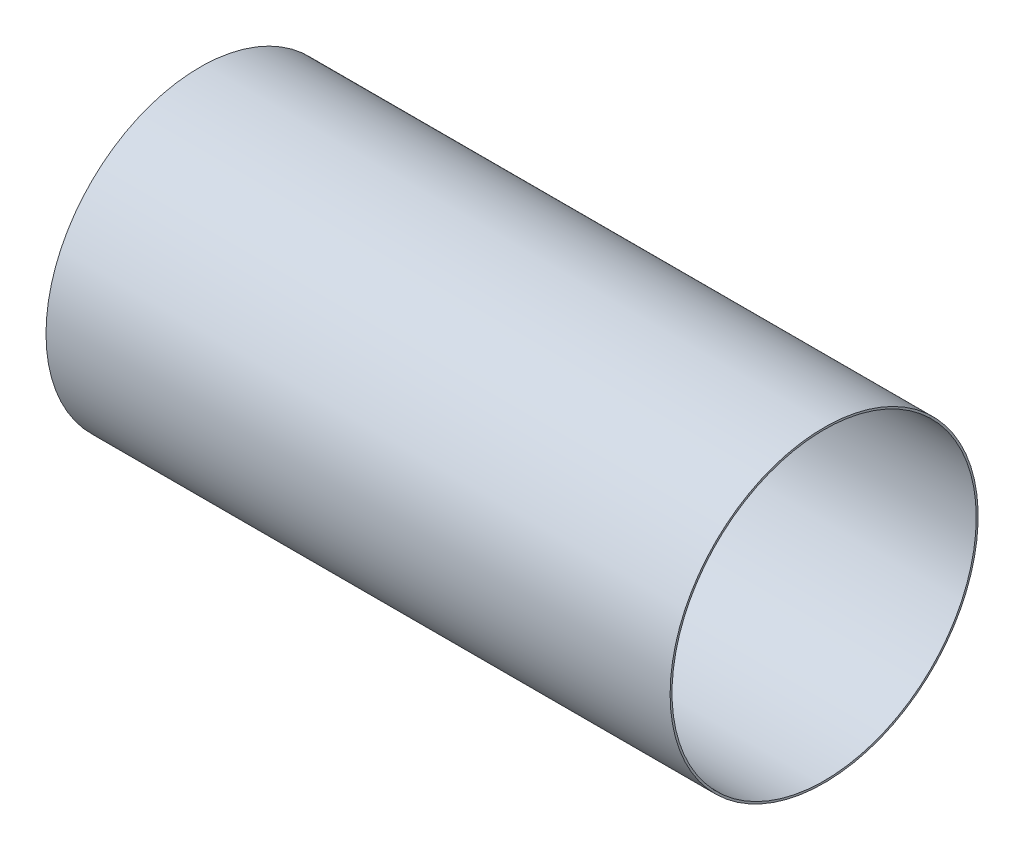
ISO-10303-21;
HEADER;
FILE_DESCRIPTION(('STEP AP214'),'2;1');
FILE_NAME('part.step','',(''),(''),'','','');
FILE_SCHEMA(('AUTOMOTIVE_DESIGN { 1 0 10303 214 1 1 1 1 }'));
ENDSEC;
DATA;
#1=APPLICATION_CONTEXT('core data for automotive mechanical design processes');
#2=APPLICATION_PROTOCOL_DEFINITION('international standard','automotive_design',2000,#1);
#3=PRODUCT_CONTEXT('',#1,'mechanical');
#4=PRODUCT('Part','Part','',(#3));
#5=PRODUCT_RELATED_PRODUCT_CATEGORY('part','',(#4));
#6=PRODUCT_DEFINITION_FORMATION('','',#4);
#7=PRODUCT_DEFINITION_CONTEXT('part definition',#1,'design');
#8=PRODUCT_DEFINITION('design','',#6,#7);
#9=PRODUCT_DEFINITION_SHAPE('','',#8);
#10=(LENGTH_UNIT() NAMED_UNIT(*) SI_UNIT(.MILLI.,.METRE.));
#11=(NAMED_UNIT(*) PLANE_ANGLE_UNIT() SI_UNIT($,.RADIAN.));
#12=(NAMED_UNIT(*) SI_UNIT($,.STERADIAN.) SOLID_ANGLE_UNIT());
#13=UNCERTAINTY_MEASURE_WITH_UNIT(LENGTH_MEASURE(1.E-05),#10,'distance_accuracy_value','');
#14=(GEOMETRIC_REPRESENTATION_CONTEXT(3) GLOBAL_UNCERTAINTY_ASSIGNED_CONTEXT((#13)) GLOBAL_UNIT_ASSIGNED_CONTEXT((#10,
#11,#12)) REPRESENTATION_CONTEXT('',''));
#15=CARTESIAN_POINT('',(0.,0.,0.));
#16=DIRECTION('',(0.,0.,1.));
#17=DIRECTION('',(1.,0.,0.));
#18=AXIS2_PLACEMENT_3D('',#15,#16,#17);
#19=CARTESIAN_POINT('',(304.8,0.,0.));
#20=DIRECTION('',(-1.,0.,0.));
#21=DIRECTION('',(0.,0.,1.));
#22=AXIS2_PLACEMENT_3D('',#19,#20,#21);
#23=CYLINDRICAL_SURFACE('',#22,75.2221);
#24=CARTESIAN_POINT('',(304.8,0.,0.));
#25=DIRECTION('',(1.,0.,0.));
#26=DIRECTION('',(0.,0.,-1.));
#27=AXIS2_PLACEMENT_3D('',#24,#25,#26);
#28=CIRCLE('',#27,75.2221);
#29=CARTESIAN_POINT('',(304.8,0.,75.2221));
#30=VERTEX_POINT('',#29);
#31=EDGE_CURVE('E10',#30,#30,#28,.T.);
#32=CARTESIAN_POINT('',(0.,0.,0.));
#33=DIRECTION('',(1.,0.,0.));
#34=DIRECTION('',(0.,0.,-1.));
#35=AXIS2_PLACEMENT_3D('',#32,#33,#34);
#36=CIRCLE('',#35,75.2221);
#37=CARTESIAN_POINT('',(0.,0.,75.2221));
#38=VERTEX_POINT('',#37);
#39=EDGE_CURVE('E46',#38,#38,#36,.T.);
#40=CARTESIAN_POINT('',(304.8,0.,75.2221));
#41=CARTESIAN_POINT('',(301.625,0.,75.2221));
#42=CARTESIAN_POINT('',(298.45,0.,75.2221));
#43=CARTESIAN_POINT('',(292.1,0.,75.2221));
#44=CARTESIAN_POINT('',(288.925,0.,75.2221));
#45=CARTESIAN_POINT('',(282.575,0.,75.2221));
#46=CARTESIAN_POINT('',(279.4,0.,75.2221));
#47=CARTESIAN_POINT('',(273.05,0.,75.2221));
#48=CARTESIAN_POINT('',(269.875,0.,75.2221));
#49=CARTESIAN_POINT('',(263.525,0.,75.2221));
#50=CARTESIAN_POINT('',(260.35,0.,75.2221));
#51=CARTESIAN_POINT('',(254.,0.,75.2221));
#52=CARTESIAN_POINT('',(250.825,0.,75.2221));
#53=CARTESIAN_POINT('',(244.475,0.,75.2221));
#54=CARTESIAN_POINT('',(241.3,0.,75.2221));
#55=CARTESIAN_POINT('',(234.95,0.,75.2221));
#56=CARTESIAN_POINT('',(231.775,0.,75.2221));
#57=CARTESIAN_POINT('',(225.425,0.,75.2221));
#58=CARTESIAN_POINT('',(222.25,0.,75.2221));
#59=CARTESIAN_POINT('',(215.9,0.,75.2221));
#60=CARTESIAN_POINT('',(212.725,0.,75.2221));
#61=CARTESIAN_POINT('',(206.375,0.,75.2221));
#62=CARTESIAN_POINT('',(203.2,0.,75.2221));
#63=CARTESIAN_POINT('',(196.85,0.,75.2221));
#64=CARTESIAN_POINT('',(193.675,0.,75.2221));
#65=CARTESIAN_POINT('',(187.325,0.,75.2221));
#66=CARTESIAN_POINT('',(184.15,0.,75.2221));
#67=CARTESIAN_POINT('',(177.8,0.,75.2221));
#68=CARTESIAN_POINT('',(174.625,0.,75.2221));
#69=CARTESIAN_POINT('',(168.275,0.,75.2221));
#70=CARTESIAN_POINT('',(165.1,0.,75.2221));
#71=CARTESIAN_POINT('',(158.75,0.,75.2221));
#72=CARTESIAN_POINT('',(155.575,0.,75.2221));
#73=CARTESIAN_POINT('',(149.225,0.,75.2221));
#74=CARTESIAN_POINT('',(146.05,0.,75.2221));
#75=CARTESIAN_POINT('',(139.7,0.,75.2221));
#76=CARTESIAN_POINT('',(136.525,0.,75.2221));
#77=CARTESIAN_POINT('',(130.175,0.,75.2221));
#78=CARTESIAN_POINT('',(127.,0.,75.2221));
#79=CARTESIAN_POINT('',(120.65,0.,75.2221));
#80=CARTESIAN_POINT('',(117.475,0.,75.2221));
#81=CARTESIAN_POINT('',(111.125,0.,75.2221));
#82=CARTESIAN_POINT('',(107.95,0.,75.2221));
#83=CARTESIAN_POINT('',(101.6,0.,75.2221));
#84=CARTESIAN_POINT('',(98.425,0.,75.2221));
#85=CARTESIAN_POINT('',(92.075,0.,75.2221));
#86=CARTESIAN_POINT('',(88.9,0.,75.2221));
#87=CARTESIAN_POINT('',(82.55,0.,75.2221));
#88=CARTESIAN_POINT('',(79.375,0.,75.2221));
#89=CARTESIAN_POINT('',(73.025,0.,75.2221));
#90=CARTESIAN_POINT('',(69.85,0.,75.2221));
#91=CARTESIAN_POINT('',(63.5,0.,75.2221));
#92=CARTESIAN_POINT('',(60.325,0.,75.2221));
#93=CARTESIAN_POINT('',(53.975,0.,75.2221));
#94=CARTESIAN_POINT('',(50.8,0.,75.2221));
#95=CARTESIAN_POINT('',(44.45,0.,75.2221));
#96=CARTESIAN_POINT('',(41.275,0.,75.2221));
#97=CARTESIAN_POINT('',(34.925,0.,75.2221));
#98=CARTESIAN_POINT('',(31.75,0.,75.2221));
#99=CARTESIAN_POINT('',(25.4,0.,75.2221));
#100=CARTESIAN_POINT('',(22.225,0.,75.2221));
#101=CARTESIAN_POINT('',(15.875,0.,75.2221));
#102=CARTESIAN_POINT('',(12.7,0.,75.2221));
#103=CARTESIAN_POINT('',(6.35,0.,75.2221));
#104=CARTESIAN_POINT('',(3.175,0.,75.2221));
#105=CARTESIAN_POINT('',(0.,0.,75.2221));
#106=B_SPLINE_CURVE_WITH_KNOTS('',3,(#40,#41,#42,#43,#44,#45,#46,#47,#48,#49,#50,#51,#52,#53,
#54,#55,#56,#57,#58,#59,#60,#61,#62,#63,#64,#65,#66,#67,#68,#69,#70,#71,#72,#73,#74,#75,#76,#77,
#78,#79,#80,#81,#82,#83,#84,#85,#86,#87,#88,#89,#90,#91,#92,#93,#94,#95,#96,#97,#98,#99,#100,
#101,#102,#103,#104,#105),.UNSPECIFIED.,.F.,.F.,(4,2,2,2,2,2,2,2,2,2,2,2,2,2,2,2,2,2,2,2,2,2,2,
2,2,2,2,2,2,2,2,2,4),(0.,9.52499999999995,19.05,28.575,38.1,47.625,57.15,66.675,76.2,85.725,
95.2499999999999,104.775,114.3,123.825,133.35,142.875,152.4,161.925,171.45,180.975,190.5,
200.025,209.55,219.075,228.6,238.125,247.65,257.175,266.7,276.225,285.75,295.275,304.8),.UNSPECIFIED.);
#107=EDGE_CURVE('BSEAM43',#30,#38,#106,.T.);
#108=ORIENTED_EDGE('',*,*,#31,.F.);
#109=ORIENTED_EDGE('',*,*,#39,.T.);
#110=ORIENTED_EDGE('',*,*,#107,.T.);
#111=ORIENTED_EDGE('',*,*,#107,.F.);
#112=EDGE_LOOP('',(#108,#110,#109,#111));
#113=FACE_BOUND('',#112,.T.);
#114=ADVANCED_FACE('F43',(#113),#23,.T.);
#115=CARTESIAN_POINT('',(304.8,0.,0.));
#116=DIRECTION('',(1.,0.,0.));
#117=DIRECTION('',(0.,0.,-1.));
#118=AXIS2_PLACEMENT_3D('',#115,#116,#117);
#119=PLANE('',#118);
#120=CARTESIAN_POINT('',(304.8,0.,0.));
#121=DIRECTION('',(1.,0.,0.));
#122=DIRECTION('',(0.,0.,-1.));
#123=AXIS2_PLACEMENT_3D('',#120,#121,#122);
#124=CIRCLE('',#123,74.2823);
#125=CARTESIAN_POINT('',(304.8,0.,-74.2823));
#126=VERTEX_POINT('',#125);
#127=EDGE_CURVE('E57',#126,#126,#124,.T.);
#128=ORIENTED_EDGE('',*,*,#127,.F.);
#129=EDGE_LOOP('',(#128));
#130=FACE_BOUND('',#129,.T.);
#131=ORIENTED_EDGE('',*,*,#31,.T.);
#132=EDGE_LOOP('',(#131));
#133=FACE_BOUND('',#132,.T.);
#134=ADVANCED_FACE('F74',(#130,#133),#119,.T.);
#135=CARTESIAN_POINT('',(0.,0.,0.));
#136=DIRECTION('',(1.,0.,0.));
#137=DIRECTION('',(0.,0.,-1.));
#138=AXIS2_PLACEMENT_3D('',#135,#136,#137);
#139=PLANE('',#138);
#140=CARTESIAN_POINT('',(0.,0.,0.));
#141=DIRECTION('',(1.,0.,0.));
#142=DIRECTION('',(0.,0.,-1.));
#143=AXIS2_PLACEMENT_3D('',#140,#141,#142);
#144=CIRCLE('',#143,74.2823);
#145=CARTESIAN_POINT('',(0.,0.,-74.2823));
#146=VERTEX_POINT('',#145);
#147=EDGE_CURVE('E55',#146,#146,#144,.T.);
#148=ORIENTED_EDGE('',*,*,#147,.T.);
#149=EDGE_LOOP('',(#148));
#150=FACE_BOUND('',#149,.T.);
#151=ORIENTED_EDGE('',*,*,#39,.F.);
#152=EDGE_LOOP('',(#151));
#153=FACE_BOUND('',#152,.T.);
#154=ADVANCED_FACE('F65',(#150,#153),#139,.F.);
#155=CARTESIAN_POINT('',(0.,0.,0.));
#156=DIRECTION('',(1.,0.,0.));
#157=DIRECTION('',(0.,0.,-1.));
#158=AXIS2_PLACEMENT_3D('',#155,#156,#157);
#159=CYLINDRICAL_SURFACE('',#158,74.2823);
#160=CARTESIAN_POINT('',(0.,0.,-74.2823));
#161=CARTESIAN_POINT('',(3.175,0.,-74.2823));
#162=CARTESIAN_POINT('',(6.35,0.,-74.2823));
#163=CARTESIAN_POINT('',(12.7,0.,-74.2823));
#164=CARTESIAN_POINT('',(15.875,0.,-74.2823));
#165=CARTESIAN_POINT('',(22.225,0.,-74.2823));
#166=CARTESIAN_POINT('',(25.4,0.,-74.2823));
#167=CARTESIAN_POINT('',(31.75,0.,-74.2823));
#168=CARTESIAN_POINT('',(34.925,0.,-74.2823));
#169=CARTESIAN_POINT('',(41.275,0.,-74.2823));
#170=CARTESIAN_POINT('',(44.45,0.,-74.2823));
#171=CARTESIAN_POINT('',(50.8,0.,-74.2823));
#172=CARTESIAN_POINT('',(53.975,0.,-74.2823));
#173=CARTESIAN_POINT('',(60.325,0.,-74.2823));
#174=CARTESIAN_POINT('',(63.5,0.,-74.2823));
#175=CARTESIAN_POINT('',(69.85,0.,-74.2823));
#176=CARTESIAN_POINT('',(73.025,0.,-74.2823));
#177=CARTESIAN_POINT('',(79.375,0.,-74.2823));
#178=CARTESIAN_POINT('',(82.55,0.,-74.2823));
#179=CARTESIAN_POINT('',(88.9,0.,-74.2823));
#180=CARTESIAN_POINT('',(92.075,0.,-74.2823));
#181=CARTESIAN_POINT('',(98.425,0.,-74.2823));
#182=CARTESIAN_POINT('',(101.6,0.,-74.2823));
#183=CARTESIAN_POINT('',(107.95,0.,-74.2823));
#184=CARTESIAN_POINT('',(111.125,0.,-74.2823));
#185=CARTESIAN_POINT('',(117.475,0.,-74.2823));
#186=CARTESIAN_POINT('',(120.65,0.,-74.2823));
#187=CARTESIAN_POINT('',(127.,0.,-74.2823));
#188=CARTESIAN_POINT('',(130.175,0.,-74.2823));
#189=CARTESIAN_POINT('',(136.525,0.,-74.2823));
#190=CARTESIAN_POINT('',(139.7,0.,-74.2823));
#191=CARTESIAN_POINT('',(146.05,0.,-74.2823));
#192=CARTESIAN_POINT('',(149.225,0.,-74.2823));
#193=CARTESIAN_POINT('',(155.575,0.,-74.2823));
#194=CARTESIAN_POINT('',(158.75,0.,-74.2823));
#195=CARTESIAN_POINT('',(165.1,0.,-74.2823));
#196=CARTESIAN_POINT('',(168.275,0.,-74.2823));
#197=CARTESIAN_POINT('',(174.625,0.,-74.2823));
#198=CARTESIAN_POINT('',(177.8,0.,-74.2823));
#199=CARTESIAN_POINT('',(184.15,0.,-74.2823));
#200=CARTESIAN_POINT('',(187.325,0.,-74.2823));
#201=CARTESIAN_POINT('',(193.675,0.,-74.2823));
#202=CARTESIAN_POINT('',(196.85,0.,-74.2823));
#203=CARTESIAN_POINT('',(203.2,0.,-74.2823));
#204=CARTESIAN_POINT('',(206.375,0.,-74.2823));
#205=CARTESIAN_POINT('',(212.725,0.,-74.2823));
#206=CARTESIAN_POINT('',(215.9,0.,-74.2823));
#207=CARTESIAN_POINT('',(222.25,0.,-74.2823));
#208=CARTESIAN_POINT('',(225.425,0.,-74.2823));
#209=CARTESIAN_POINT('',(231.775,0.,-74.2823));
#210=CARTESIAN_POINT('',(234.95,0.,-74.2823));
#211=CARTESIAN_POINT('',(241.3,0.,-74.2823));
#212=CARTESIAN_POINT('',(244.475,0.,-74.2823));
#213=CARTESIAN_POINT('',(250.825,0.,-74.2823));
#214=CARTESIAN_POINT('',(254.,0.,-74.2823));
#215=CARTESIAN_POINT('',(260.35,0.,-74.2823));
#216=CARTESIAN_POINT('',(263.525,0.,-74.2823));
#217=CARTESIAN_POINT('',(269.875,0.,-74.2823));
#218=CARTESIAN_POINT('',(273.05,0.,-74.2823));
#219=CARTESIAN_POINT('',(279.4,0.,-74.2823));
#220=CARTESIAN_POINT('',(282.575,0.,-74.2823));
#221=CARTESIAN_POINT('',(288.925,0.,-74.2823));
#222=CARTESIAN_POINT('',(292.1,0.,-74.2823));
#223=CARTESIAN_POINT('',(298.45,0.,-74.2823));
#224=CARTESIAN_POINT('',(301.625,0.,-74.2823));
#225=CARTESIAN_POINT('',(304.8,0.,-74.2823));
#226=B_SPLINE_CURVE_WITH_KNOTS('',3,(#160,#161,#162,#163,#164,#165,#166,#167,#168,#169,#170,
#171,#172,#173,#174,#175,#176,#177,#178,#179,#180,#181,#182,#183,#184,#185,#186,#187,#188,#189,
#190,#191,#192,#193,#194,#195,#196,#197,#198,#199,#200,#201,#202,#203,#204,#205,#206,#207,#208,
#209,#210,#211,#212,#213,#214,#215,#216,#217,#218,#219,#220,#221,#222,#223,#224,#225),
.UNSPECIFIED.,.F.,.F.,(4,2,2,2,2,2,2,2,2,2,2,2,2,2,2,2,2,2,2,2,2,2,2,2,2,2,2,2,2,2,2,2,4),(0.,
9.525,19.05,28.575,38.1,47.625,57.15,66.675,76.2,85.725,95.25,104.775,114.3,123.825,133.35,
142.875,152.4,161.925,171.45,180.975,190.5,200.025,209.55,219.075,228.6,238.125,247.65,257.175,
266.7,276.225,285.75,295.275,304.8),.UNSPECIFIED.);
#227=EDGE_CURVE('BSEAM68',#146,#126,#226,.T.);
#228=ORIENTED_EDGE('',*,*,#147,.F.);
#229=ORIENTED_EDGE('',*,*,#127,.T.);
#230=ORIENTED_EDGE('',*,*,#227,.T.);
#231=ORIENTED_EDGE('',*,*,#227,.F.);
#232=EDGE_LOOP('',(#228,#230,#229,#231));
#233=FACE_BOUND('',#232,.T.);
#234=ADVANCED_FACE('F68',(#233),#159,.F.);
#235=CLOSED_SHELL('',(#114,#134,#154,#234));
#236=MANIFOLD_SOLID_BREP('B2',#235);
#237=ADVANCED_BREP_SHAPE_REPRESENTATION('',(#18,#236),#14);
#238=SHAPE_DEFINITION_REPRESENTATION(#9,#237);
ENDSEC;
END-ISO-10303-21;
